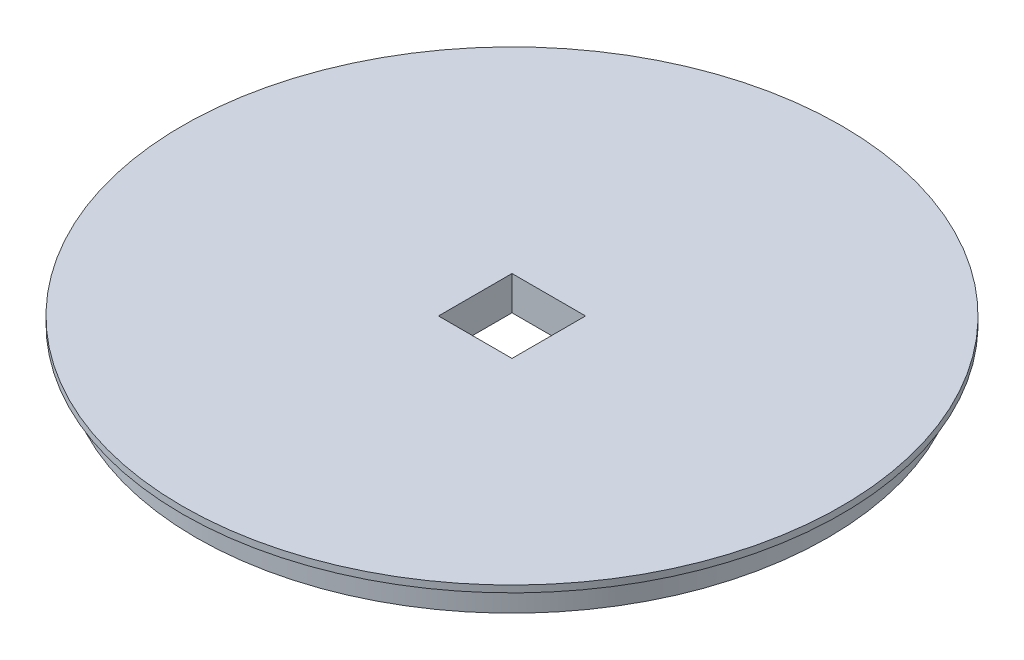
ISO-10303-21;
HEADER;
FILE_DESCRIPTION(('STEP AP214'),'2;1');
FILE_NAME('part.step','',(''),(''),'','','');
FILE_SCHEMA(('AUTOMOTIVE_DESIGN { 1 0 10303 214 1 1 1 1 }'));
ENDSEC;
DATA;
#1=APPLICATION_CONTEXT('core data for automotive mechanical design processes');
#2=APPLICATION_PROTOCOL_DEFINITION('international standard','automotive_design',2000,#1);
#3=PRODUCT_CONTEXT('',#1,'mechanical');
#4=PRODUCT('Part','Part','',(#3));
#5=PRODUCT_RELATED_PRODUCT_CATEGORY('part','',(#4));
#6=PRODUCT_DEFINITION_FORMATION('','',#4);
#7=PRODUCT_DEFINITION_CONTEXT('part definition',#1,'design');
#8=PRODUCT_DEFINITION('design','',#6,#7);
#9=PRODUCT_DEFINITION_SHAPE('','',#8);
#10=(LENGTH_UNIT() NAMED_UNIT(*) SI_UNIT(.MILLI.,.METRE.));
#11=(NAMED_UNIT(*) PLANE_ANGLE_UNIT() SI_UNIT($,.RADIAN.));
#12=(NAMED_UNIT(*) SI_UNIT($,.STERADIAN.) SOLID_ANGLE_UNIT());
#13=UNCERTAINTY_MEASURE_WITH_UNIT(LENGTH_MEASURE(1.E-05),#10,'distance_accuracy_value','');
#14=(GEOMETRIC_REPRESENTATION_CONTEXT(3) GLOBAL_UNCERTAINTY_ASSIGNED_CONTEXT((#13)) GLOBAL_UNIT_ASSIGNED_CONTEXT((#10,
#11,#12)) REPRESENTATION_CONTEXT('',''));
#15=CARTESIAN_POINT('',(0.,0.,0.));
#16=DIRECTION('',(0.,0.,1.));
#17=DIRECTION('',(1.,0.,0.));
#18=AXIS2_PLACEMENT_3D('',#15,#16,#17);
#19=CARTESIAN_POINT('',(0.,3.175,0.));
#20=DIRECTION('',(0.,-1.,0.));
#21=DIRECTION('',(0.,0.,-1.));
#22=AXIS2_PLACEMENT_3D('',#19,#20,#21);
#23=PLANE('',#22);
#24=DIRECTION('',(-1.,0.,0.));
#25=VECTOR('',#24,1.);
#26=CARTESIAN_POINT('',(-3.429,3.175,-3.429));
#27=LINE('',#26,#25);
#28=CARTESIAN_POINT('',(3.429,3.175,-3.429));
#29=VERTEX_POINT('',#28);
#30=CARTESIAN_POINT('',(-3.429,3.175,-3.429));
#31=VERTEX_POINT('',#30);
#32=EDGE_CURVE('E118',#29,#31,#27,.T.);
#33=ORIENTED_EDGE('',*,*,#32,.F.);
#34=DIRECTION('',(0.,0.,-1.));
#35=VECTOR('',#34,1.);
#36=CARTESIAN_POINT('',(3.429,3.175,3.429));
#37=LINE('',#36,#35);
#38=CARTESIAN_POINT('',(3.429,3.175,3.429));
#39=VERTEX_POINT('',#38);
#40=EDGE_CURVE('E58',#39,#29,#37,.T.);
#41=ORIENTED_EDGE('',*,*,#40,.F.);
#42=DIRECTION('',(1.,0.,0.));
#43=VECTOR('',#42,1.);
#44=CARTESIAN_POINT('',(-3.429,3.175,3.429));
#45=LINE('',#44,#43);
#46=CARTESIAN_POINT('',(-3.429,3.175,3.429));
#47=VERTEX_POINT('',#46);
#48=EDGE_CURVE('E105',#47,#39,#45,.T.);
#49=ORIENTED_EDGE('',*,*,#48,.F.);
#50=DIRECTION('',(0.,0.,1.));
#51=VECTOR('',#50,1.);
#52=CARTESIAN_POINT('',(-3.429,3.175,3.429));
#53=LINE('',#52,#51);
#54=EDGE_CURVE('E109',#31,#47,#53,.T.);
#55=ORIENTED_EDGE('',*,*,#54,.F.);
#56=EDGE_LOOP('',(#33,#41,#49,#55));
#57=FACE_BOUND('',#56,.T.);
#58=CARTESIAN_POINT('',(0.,3.175,0.));
#59=DIRECTION('',(0.,-1.,0.));
#60=DIRECTION('',(0.,0.,-1.));
#61=AXIS2_PLACEMENT_3D('',#58,#59,#60);
#62=CIRCLE('',#61,30.734);
#63=CARTESIAN_POINT('',(0.,3.175,-30.734));
#64=VERTEX_POINT('',#63);
#65=EDGE_CURVE('E11',#64,#64,#62,.T.);
#66=ORIENTED_EDGE('',*,*,#65,.F.);
#67=EDGE_LOOP('',(#66));
#68=FACE_BOUND('',#67,.T.);
#69=ADVANCED_FACE('F43',(#57,#68),#23,.F.);
#70=CARTESIAN_POINT('',(0.,0.,0.));
#71=DIRECTION('',(0.,-1.,0.));
#72=DIRECTION('',(0.,0.,-1.));
#73=AXIS2_PLACEMENT_3D('',#70,#71,#72);
#74=CYLINDRICAL_SURFACE('',#73,30.734);
#75=CARTESIAN_POINT('',(0.,2.54,0.));
#76=DIRECTION('',(0.,-1.,0.));
#77=DIRECTION('',(0.,0.,-1.));
#78=AXIS2_PLACEMENT_3D('',#75,#76,#77);
#79=CIRCLE('',#78,30.734);
#80=CARTESIAN_POINT('',(0.,2.54,-30.734));
#81=VERTEX_POINT('',#80);
#82=EDGE_CURVE('E51',#81,#81,#79,.T.);
#83=ORIENTED_EDGE('',*,*,#82,.F.);
#84=EDGE_LOOP('',(#83));
#85=FACE_BOUND('',#84,.T.);
#86=ORIENTED_EDGE('',*,*,#65,.T.);
#87=EDGE_LOOP('',(#86));
#88=FACE_BOUND('',#87,.T.);
#89=ADVANCED_FACE('F145',(#85,#88),#74,.T.);
#90=CARTESIAN_POINT('',(-30.734,2.54,0.));
#91=DIRECTION('',(0.,1.,0.));
#92=DIRECTION('',(0.,0.,1.));
#93=AXIS2_PLACEMENT_3D('',#90,#91,#92);
#94=PLANE('',#93);
#95=CARTESIAN_POINT('',(0.,2.54,0.));
#96=DIRECTION('',(0.,-1.,0.));
#97=DIRECTION('',(0.,0.,-1.));
#98=AXIS2_PLACEMENT_3D('',#95,#96,#97);
#99=CIRCLE('',#98,29.464);
#100=CARTESIAN_POINT('',(0.,2.54,-29.464));
#101=VERTEX_POINT('',#100);
#102=EDGE_CURVE('E136',#101,#101,#99,.T.);
#103=ORIENTED_EDGE('',*,*,#102,.F.);
#104=EDGE_LOOP('',(#103));
#105=FACE_BOUND('',#104,.T.);
#106=ORIENTED_EDGE('',*,*,#82,.T.);
#107=EDGE_LOOP('',(#106));
#108=FACE_BOUND('',#107,.T.);
#109=ADVANCED_FACE('F143',(#105,#108),#94,.F.);
#110=CARTESIAN_POINT('',(0.,0.,0.));
#111=DIRECTION('',(0.,-1.,0.));
#112=DIRECTION('',(0.,0.,-1.));
#113=AXIS2_PLACEMENT_3D('',#110,#111,#112);
#114=CYLINDRICAL_SURFACE('',#113,29.464);
#115=CARTESIAN_POINT('',(0.,0.,0.));
#116=DIRECTION('',(0.,-1.,0.));
#117=DIRECTION('',(0.,0.,-1.));
#118=AXIS2_PLACEMENT_3D('',#115,#116,#117);
#119=CIRCLE('',#118,29.464);
#120=CARTESIAN_POINT('',(0.,0.,-29.464));
#121=VERTEX_POINT('',#120);
#122=EDGE_CURVE('E127',#121,#121,#119,.T.);
#123=ORIENTED_EDGE('',*,*,#122,.F.);
#124=EDGE_LOOP('',(#123));
#125=FACE_BOUND('',#124,.T.);
#126=ORIENTED_EDGE('',*,*,#102,.T.);
#127=EDGE_LOOP('',(#126));
#128=FACE_BOUND('',#127,.T.);
#129=ADVANCED_FACE('F172',(#125,#128),#114,.T.);
#130=CARTESIAN_POINT('',(-29.464,0.,0.));
#131=DIRECTION('',(0.,1.,0.));
#132=DIRECTION('',(0.,0.,1.));
#133=AXIS2_PLACEMENT_3D('',#130,#131,#132);
#134=PLANE('',#133);
#135=DIRECTION('',(1.,0.,0.));
#136=VECTOR('',#135,1.);
#137=CARTESIAN_POINT('',(-3.429,0.,3.429));
#138=LINE('',#137,#136);
#139=CARTESIAN_POINT('',(-3.429,0.,3.429));
#140=VERTEX_POINT('',#139);
#141=CARTESIAN_POINT('',(3.429,0.,3.429));
#142=VERTEX_POINT('',#141);
#143=EDGE_CURVE('E93',#140,#142,#138,.T.);
#144=ORIENTED_EDGE('',*,*,#143,.T.);
#145=DIRECTION('',(0.,0.,-1.));
#146=VECTOR('',#145,1.);
#147=CARTESIAN_POINT('',(3.429,0.,3.429));
#148=LINE('',#147,#146);
#149=CARTESIAN_POINT('',(3.429,0.,-3.429));
#150=VERTEX_POINT('',#149);
#151=EDGE_CURVE('E86',#142,#150,#148,.T.);
#152=ORIENTED_EDGE('',*,*,#151,.T.);
#153=DIRECTION('',(-1.,0.,0.));
#154=VECTOR('',#153,1.);
#155=CARTESIAN_POINT('',(-3.429,0.,-3.429));
#156=LINE('',#155,#154);
#157=CARTESIAN_POINT('',(-3.429,0.,-3.429));
#158=VERTEX_POINT('',#157);
#159=EDGE_CURVE('E96',#150,#158,#156,.T.);
#160=ORIENTED_EDGE('',*,*,#159,.T.);
#161=DIRECTION('',(0.,0.,1.));
#162=VECTOR('',#161,1.);
#163=CARTESIAN_POINT('',(-3.429,0.,3.429));
#164=LINE('',#163,#162);
#165=EDGE_CURVE('E66',#158,#140,#164,.T.);
#166=ORIENTED_EDGE('',*,*,#165,.T.);
#167=EDGE_LOOP('',(#144,#152,#160,#166));
#168=FACE_BOUND('',#167,.T.);
#169=ORIENTED_EDGE('',*,*,#122,.T.);
#170=EDGE_LOOP('',(#169));
#171=FACE_BOUND('',#170,.T.);
#172=ADVANCED_FACE('F101',(#168,#171),#134,.F.);
#173=CARTESIAN_POINT('',(3.429,0.,3.429));
#174=DIRECTION('',(1.,0.,0.));
#175=DIRECTION('',(0.,0.,-1.));
#176=AXIS2_PLACEMENT_3D('',#173,#174,#175);
#177=PLANE('',#176);
#178=ORIENTED_EDGE('',*,*,#40,.T.);
#179=DIRECTION('',(0.,1.,0.));
#180=VECTOR('',#179,1.);
#181=CARTESIAN_POINT('',(3.429,0.,-3.429));
#182=LINE('',#181,#180);
#183=EDGE_CURVE('E82',#150,#29,#182,.T.);
#184=ORIENTED_EDGE('',*,*,#183,.F.);
#185=ORIENTED_EDGE('',*,*,#151,.F.);
#186=DIRECTION('',(0.,1.,0.));
#187=VECTOR('',#186,1.);
#188=CARTESIAN_POINT('',(3.429,0.,3.429));
#189=LINE('',#188,#187);
#190=EDGE_CURVE('E124',#142,#39,#189,.T.);
#191=ORIENTED_EDGE('',*,*,#190,.T.);
#192=EDGE_LOOP('',(#178,#184,#185,#191));
#193=FACE_BOUND('',#192,.T.);
#194=ADVANCED_FACE('F84',(#193),#177,.F.);
#195=CARTESIAN_POINT('',(-3.429,0.,3.429));
#196=DIRECTION('',(0.,0.,1.));
#197=DIRECTION('',(1.,0.,0.));
#198=AXIS2_PLACEMENT_3D('',#195,#196,#197);
#199=PLANE('',#198);
#200=ORIENTED_EDGE('',*,*,#48,.T.);
#201=ORIENTED_EDGE('',*,*,#190,.F.);
#202=ORIENTED_EDGE('',*,*,#143,.F.);
#203=DIRECTION('',(0.,1.,0.));
#204=VECTOR('',#203,1.);
#205=CARTESIAN_POINT('',(-3.429,0.,3.429));
#206=LINE('',#205,#204);
#207=EDGE_CURVE('E128',#140,#47,#206,.T.);
#208=ORIENTED_EDGE('',*,*,#207,.T.);
#209=EDGE_LOOP('',(#200,#201,#202,#208));
#210=FACE_BOUND('',#209,.T.);
#211=ADVANCED_FACE('F158',(#210),#199,.F.);
#212=CARTESIAN_POINT('',(-3.429,0.,3.429));
#213=DIRECTION('',(-1.,0.,0.));
#214=DIRECTION('',(0.,0.,1.));
#215=AXIS2_PLACEMENT_3D('',#212,#213,#214);
#216=PLANE('',#215);
#217=ORIENTED_EDGE('',*,*,#54,.T.);
#218=ORIENTED_EDGE('',*,*,#207,.F.);
#219=ORIENTED_EDGE('',*,*,#165,.F.);
#220=DIRECTION('',(0.,1.,0.));
#221=VECTOR('',#220,1.);
#222=CARTESIAN_POINT('',(-3.429,0.,-3.429));
#223=LINE('',#222,#221);
#224=EDGE_CURVE('E92',#158,#31,#223,.T.);
#225=ORIENTED_EDGE('',*,*,#224,.T.);
#226=EDGE_LOOP('',(#217,#218,#219,#225));
#227=FACE_BOUND('',#226,.T.);
#228=ADVANCED_FACE('F156',(#227),#216,.F.);
#229=CARTESIAN_POINT('',(-3.429,0.,-3.429));
#230=DIRECTION('',(0.,0.,-1.));
#231=DIRECTION('',(-1.,0.,0.));
#232=AXIS2_PLACEMENT_3D('',#229,#230,#231);
#233=PLANE('',#232);
#234=ORIENTED_EDGE('',*,*,#32,.T.);
#235=ORIENTED_EDGE('',*,*,#224,.F.);
#236=ORIENTED_EDGE('',*,*,#159,.F.);
#237=ORIENTED_EDGE('',*,*,#183,.T.);
#238=EDGE_LOOP('',(#234,#235,#236,#237));
#239=FACE_BOUND('',#238,.T.);
#240=ADVANCED_FACE('F97',(#239),#233,.F.);
#241=CLOSED_SHELL('',(#69,#89,#109,#129,#172,#194,#211,#228,#240));
#242=MANIFOLD_SOLID_BREP('B2',#241);
#243=ADVANCED_BREP_SHAPE_REPRESENTATION('',(#18,#242),#14);
#244=SHAPE_DEFINITION_REPRESENTATION(#9,#243);
ENDSEC;
END-ISO-10303-21;
